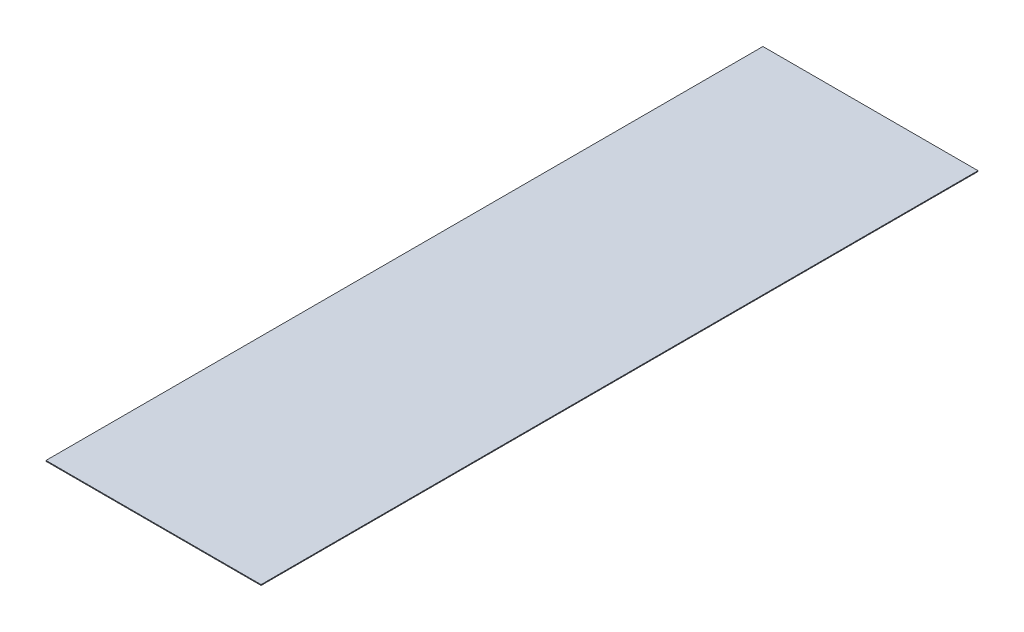
ISO-10303-21;
HEADER;
FILE_DESCRIPTION(('STEP AP214'),'2;1');
FILE_NAME('part.step','',(''),(''),'','','');
FILE_SCHEMA(('AUTOMOTIVE_DESIGN { 1 0 10303 214 1 1 1 1 }'));
ENDSEC;
DATA;
#1=APPLICATION_CONTEXT('core data for automotive mechanical design processes');
#2=APPLICATION_PROTOCOL_DEFINITION('international standard','automotive_design',2000,#1);
#3=PRODUCT_CONTEXT('',#1,'mechanical');
#4=PRODUCT('Part','Part','',(#3));
#5=PRODUCT_RELATED_PRODUCT_CATEGORY('part','',(#4));
#6=PRODUCT_DEFINITION_FORMATION('','',#4);
#7=PRODUCT_DEFINITION_CONTEXT('part definition',#1,'design');
#8=PRODUCT_DEFINITION('design','',#6,#7);
#9=PRODUCT_DEFINITION_SHAPE('','',#8);
#10=(LENGTH_UNIT() NAMED_UNIT(*) SI_UNIT(.MILLI.,.METRE.));
#11=(NAMED_UNIT(*) PLANE_ANGLE_UNIT() SI_UNIT($,.RADIAN.));
#12=(NAMED_UNIT(*) SI_UNIT($,.STERADIAN.) SOLID_ANGLE_UNIT());
#13=UNCERTAINTY_MEASURE_WITH_UNIT(LENGTH_MEASURE(1.E-05),#10,'distance_accuracy_value','');
#14=(GEOMETRIC_REPRESENTATION_CONTEXT(3) GLOBAL_UNCERTAINTY_ASSIGNED_CONTEXT((#13)) GLOBAL_UNIT_ASSIGNED_CONTEXT((#10,
#11,#12)) REPRESENTATION_CONTEXT('',''));
#15=CARTESIAN_POINT('',(0.,0.,0.));
#16=DIRECTION('',(0.,0.,1.));
#17=DIRECTION('',(1.,0.,0.));
#18=AXIS2_PLACEMENT_3D('',#15,#16,#17);
#19=CARTESIAN_POINT('',(457.2,3.4,1524.));
#20=DIRECTION('',(-1.,0.,0.));
#21=DIRECTION('',(0.,0.,1.));
#22=AXIS2_PLACEMENT_3D('',#19,#20,#21);
#23=PLANE('',#22);
#24=DIRECTION('',(0.,0.,-1.));
#25=VECTOR('',#24,1.);
#26=CARTESIAN_POINT('',(457.2,0.,1524.));
#27=LINE('',#26,#25);
#28=CARTESIAN_POINT('',(457.2,0.,1524.));
#29=VERTEX_POINT('',#28);
#30=CARTESIAN_POINT('',(457.2,0.,-1524.));
#31=VERTEX_POINT('',#30);
#32=EDGE_CURVE('E96',#29,#31,#27,.T.);
#33=ORIENTED_EDGE('',*,*,#32,.T.);
#34=DIRECTION('',(0.,-1.,0.));
#35=VECTOR('',#34,1.);
#36=CARTESIAN_POINT('',(457.2,3.4,-1524.));
#37=LINE('',#36,#35);
#38=CARTESIAN_POINT('',(457.2,3.4,-1524.));
#39=VERTEX_POINT('',#38);
#40=EDGE_CURVE('E11',#39,#31,#37,.T.);
#41=ORIENTED_EDGE('',*,*,#40,.F.);
#42=DIRECTION('',(0.,0.,-1.));
#43=VECTOR('',#42,1.);
#44=CARTESIAN_POINT('',(457.2,3.4,1524.));
#45=LINE('',#44,#43);
#46=CARTESIAN_POINT('',(457.2,3.4,1524.));
#47=VERTEX_POINT('',#46);
#48=EDGE_CURVE('E84',#47,#39,#45,.T.);
#49=ORIENTED_EDGE('',*,*,#48,.F.);
#50=DIRECTION('',(0.,-1.,0.));
#51=VECTOR('',#50,1.);
#52=CARTESIAN_POINT('',(457.2,3.4,1524.));
#53=LINE('',#52,#51);
#54=EDGE_CURVE('E92',#47,#29,#53,.T.);
#55=ORIENTED_EDGE('',*,*,#54,.T.);
#56=EDGE_LOOP('',(#33,#41,#49,#55));
#57=FACE_BOUND('',#56,.T.);
#58=ADVANCED_FACE('F33',(#57),#23,.F.);
#59=CARTESIAN_POINT('',(-457.2,3.4,-1524.));
#60=DIRECTION('',(0.,0.,1.));
#61=DIRECTION('',(1.,0.,0.));
#62=AXIS2_PLACEMENT_3D('',#59,#60,#61);
#63=PLANE('',#62);
#64=DIRECTION('',(-1.,0.,0.));
#65=VECTOR('',#64,1.);
#66=CARTESIAN_POINT('',(-457.2,0.,-1524.));
#67=LINE('',#66,#65);
#68=CARTESIAN_POINT('',(-457.2,0.,-1524.));
#69=VERTEX_POINT('',#68);
#70=EDGE_CURVE('E88',#31,#69,#67,.T.);
#71=ORIENTED_EDGE('',*,*,#70,.T.);
#72=DIRECTION('',(0.,-1.,0.));
#73=VECTOR('',#72,1.);
#74=CARTESIAN_POINT('',(-457.2,3.4,-1524.));
#75=LINE('',#74,#73);
#76=CARTESIAN_POINT('',(-457.2,3.4,-1524.));
#77=VERTEX_POINT('',#76);
#78=EDGE_CURVE('E41',#77,#69,#75,.T.);
#79=ORIENTED_EDGE('',*,*,#78,.F.);
#80=DIRECTION('',(-1.,0.,0.));
#81=VECTOR('',#80,1.);
#82=CARTESIAN_POINT('',(-457.2,3.4,-1524.));
#83=LINE('',#82,#81);
#84=EDGE_CURVE('E79',#39,#77,#83,.T.);
#85=ORIENTED_EDGE('',*,*,#84,.F.);
#86=ORIENTED_EDGE('',*,*,#40,.T.);
#87=EDGE_LOOP('',(#71,#79,#85,#86));
#88=FACE_BOUND('',#87,.T.);
#89=ADVANCED_FACE('F87',(#88),#63,.F.);
#90=CARTESIAN_POINT('',(-457.2,3.4,1524.));
#91=DIRECTION('',(1.,0.,0.));
#92=DIRECTION('',(0.,0.,-1.));
#93=AXIS2_PLACEMENT_3D('',#90,#91,#92);
#94=PLANE('',#93);
#95=DIRECTION('',(0.,0.,1.));
#96=VECTOR('',#95,1.);
#97=CARTESIAN_POINT('',(-457.2,0.,1524.));
#98=LINE('',#97,#96);
#99=CARTESIAN_POINT('',(-457.2,0.,1524.));
#100=VERTEX_POINT('',#99);
#101=EDGE_CURVE('E66',#69,#100,#98,.T.);
#102=ORIENTED_EDGE('',*,*,#101,.T.);
#103=DIRECTION('',(0.,-1.,0.));
#104=VECTOR('',#103,1.);
#105=CARTESIAN_POINT('',(-457.2,3.4,1524.));
#106=LINE('',#105,#104);
#107=CARTESIAN_POINT('',(-457.2,3.4,1524.));
#108=VERTEX_POINT('',#107);
#109=EDGE_CURVE('E89',#108,#100,#106,.T.);
#110=ORIENTED_EDGE('',*,*,#109,.F.);
#111=DIRECTION('',(0.,0.,1.));
#112=VECTOR('',#111,1.);
#113=CARTESIAN_POINT('',(-457.2,3.4,1524.));
#114=LINE('',#113,#112);
#115=EDGE_CURVE('E82',#77,#108,#114,.T.);
#116=ORIENTED_EDGE('',*,*,#115,.F.);
#117=ORIENTED_EDGE('',*,*,#78,.T.);
#118=EDGE_LOOP('',(#102,#110,#116,#117));
#119=FACE_BOUND('',#118,.T.);
#120=ADVANCED_FACE('F90',(#119),#94,.F.);
#121=CARTESIAN_POINT('',(-457.2,3.4,1524.));
#122=DIRECTION('',(0.,0.,-1.));
#123=DIRECTION('',(-1.,0.,0.));
#124=AXIS2_PLACEMENT_3D('',#121,#122,#123);
#125=PLANE('',#124);
#126=DIRECTION('',(1.,0.,0.));
#127=VECTOR('',#126,1.);
#128=CARTESIAN_POINT('',(-457.2,0.,1524.));
#129=LINE('',#128,#127);
#130=EDGE_CURVE('E72',#100,#29,#129,.T.);
#131=ORIENTED_EDGE('',*,*,#130,.T.);
#132=ORIENTED_EDGE('',*,*,#54,.F.);
#133=DIRECTION('',(1.,0.,0.));
#134=VECTOR('',#133,1.);
#135=CARTESIAN_POINT('',(-457.2,3.4,1524.));
#136=LINE('',#135,#134);
#137=EDGE_CURVE('E49',#108,#47,#136,.T.);
#138=ORIENTED_EDGE('',*,*,#137,.F.);
#139=ORIENTED_EDGE('',*,*,#109,.T.);
#140=EDGE_LOOP('',(#131,#132,#138,#139));
#141=FACE_BOUND('',#140,.T.);
#142=ADVANCED_FACE('F103',(#141),#125,.F.);
#143=CARTESIAN_POINT('',(0.,3.4,0.));
#144=DIRECTION('',(0.,-1.,0.));
#145=DIRECTION('',(0.,0.,-1.));
#146=AXIS2_PLACEMENT_3D('',#143,#144,#145);
#147=PLANE('',#146);
#148=ORIENTED_EDGE('',*,*,#48,.T.);
#149=ORIENTED_EDGE('',*,*,#84,.T.);
#150=ORIENTED_EDGE('',*,*,#115,.T.);
#151=ORIENTED_EDGE('',*,*,#137,.T.);
#152=EDGE_LOOP('',(#148,#149,#150,#151));
#153=FACE_BOUND('',#152,.T.);
#154=ADVANCED_FACE('F80',(#153),#147,.F.);
#155=CARTESIAN_POINT('',(0.,0.,0.));
#156=DIRECTION('',(0.,-1.,0.));
#157=DIRECTION('',(0.,0.,-1.));
#158=AXIS2_PLACEMENT_3D('',#155,#156,#157);
#159=PLANE('',#158);
#160=ORIENTED_EDGE('',*,*,#32,.F.);
#161=ORIENTED_EDGE('',*,*,#130,.F.);
#162=ORIENTED_EDGE('',*,*,#101,.F.);
#163=ORIENTED_EDGE('',*,*,#70,.F.);
#164=EDGE_LOOP('',(#160,#161,#162,#163));
#165=FACE_BOUND('',#164,.T.);
#166=ADVANCED_FACE('F106',(#165),#159,.T.);
#167=CLOSED_SHELL('',(#58,#89,#120,#142,#154,#166));
#168=MANIFOLD_SOLID_BREP('B2',#167);
#169=ADVANCED_BREP_SHAPE_REPRESENTATION('',(#18,#168),#14);
#170=SHAPE_DEFINITION_REPRESENTATION(#9,#169);
ENDSEC;
END-ISO-10303-21;
